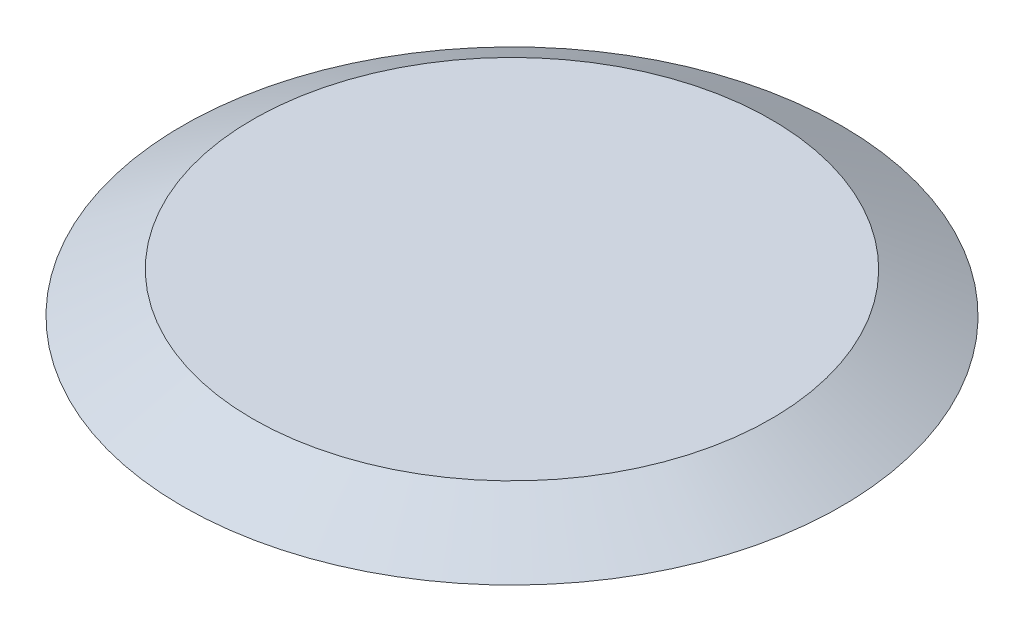
ISO-10303-21;
HEADER;
FILE_DESCRIPTION(('STEP AP214'),'2;1');
FILE_NAME('part.step','',(''),(''),'','','');
FILE_SCHEMA(('AUTOMOTIVE_DESIGN { 1 0 10303 214 1 1 1 1 }'));
ENDSEC;
DATA;
#1=APPLICATION_CONTEXT('core data for automotive mechanical design processes');
#2=APPLICATION_PROTOCOL_DEFINITION('international standard','automotive_design',2000,#1);
#3=PRODUCT_CONTEXT('',#1,'mechanical');
#4=PRODUCT('Part','Part','',(#3));
#5=PRODUCT_RELATED_PRODUCT_CATEGORY('part','',(#4));
#6=PRODUCT_DEFINITION_FORMATION('','',#4);
#7=PRODUCT_DEFINITION_CONTEXT('part definition',#1,'design');
#8=PRODUCT_DEFINITION('design','',#6,#7);
#9=PRODUCT_DEFINITION_SHAPE('','',#8);
#10=(LENGTH_UNIT() NAMED_UNIT(*) SI_UNIT(.MILLI.,.METRE.));
#11=(NAMED_UNIT(*) PLANE_ANGLE_UNIT() SI_UNIT($,.RADIAN.));
#12=(NAMED_UNIT(*) SI_UNIT($,.STERADIAN.) SOLID_ANGLE_UNIT());
#13=UNCERTAINTY_MEASURE_WITH_UNIT(LENGTH_MEASURE(1.E-05),#10,'distance_accuracy_value','');
#14=(GEOMETRIC_REPRESENTATION_CONTEXT(3) GLOBAL_UNCERTAINTY_ASSIGNED_CONTEXT((#13)) GLOBAL_UNIT_ASSIGNED_CONTEXT((#10,
#11,#12)) REPRESENTATION_CONTEXT('',''));
#15=CARTESIAN_POINT('',(0.,0.,0.));
#16=DIRECTION('',(0.,0.,1.));
#17=DIRECTION('',(1.,0.,0.));
#18=AXIS2_PLACEMENT_3D('',#15,#16,#17);
#19=CARTESIAN_POINT('',(0.,0.,0.));
#20=DIRECTION('',(0.,-1.,0.));
#21=DIRECTION('',(0.,0.,1.));
#22=AXIS2_PLACEMENT_3D('',#19,#20,#21);
#23=CONICAL_SURFACE('',#22,8.255,1.0471975511966);
#24=CARTESIAN_POINT('',(0.,1.016,0.));
#25=DIRECTION('',(0.,1.,0.));
#26=DIRECTION('',(0.,0.,1.));
#27=AXIS2_PLACEMENT_3D('',#24,#25,#26);
#28=CIRCLE('',#27,6.49523637951001);
#29=CARTESIAN_POINT('',(0.,1.016,6.49523637951001));
#30=VERTEX_POINT('',#29);
#31=EDGE_CURVE('E10',#30,#30,#28,.T.);
#32=ORIENTED_EDGE('',*,*,#31,.F.);
#33=EDGE_LOOP('',(#32));
#34=FACE_BOUND('',#33,.T.);
#35=CARTESIAN_POINT('',(0.,0.,0.));
#36=DIRECTION('',(0.,1.,0.));
#37=DIRECTION('',(0.,0.,1.));
#38=AXIS2_PLACEMENT_3D('',#35,#36,#37);
#39=CIRCLE('',#38,8.255);
#40=CARTESIAN_POINT('',(0.,0.,8.255));
#41=VERTEX_POINT('',#40);
#42=EDGE_CURVE('E50',#41,#41,#39,.T.);
#43=ORIENTED_EDGE('',*,*,#42,.T.);
#44=EDGE_LOOP('',(#43));
#45=FACE_BOUND('',#44,.T.);
#46=ADVANCED_FACE('F43',(#34,#45),#23,.T.);
#47=CARTESIAN_POINT('',(0.,1.016,0.));
#48=DIRECTION('',(0.,1.,0.));
#49=DIRECTION('',(0.,0.,1.));
#50=AXIS2_PLACEMENT_3D('',#47,#48,#49);
#51=PLANE('',#50);
#52=ORIENTED_EDGE('',*,*,#31,.T.);
#53=EDGE_LOOP('',(#52));
#54=FACE_BOUND('',#53,.T.);
#55=ADVANCED_FACE('F60',(#54),#51,.T.);
#56=CARTESIAN_POINT('',(0.,0.,0.));
#57=DIRECTION('',(0.,1.,0.));
#58=DIRECTION('',(0.,0.,1.));
#59=AXIS2_PLACEMENT_3D('',#56,#57,#58);
#60=PLANE('',#59);
#61=ORIENTED_EDGE('',*,*,#42,.F.);
#62=EDGE_LOOP('',(#61));
#63=FACE_BOUND('',#62,.T.);
#64=ADVANCED_FACE('F58',(#63),#60,.F.);
#65=CLOSED_SHELL('',(#46,#55,#64));
#66=MANIFOLD_SOLID_BREP('B2',#65);
#67=ADVANCED_BREP_SHAPE_REPRESENTATION('',(#18,#66),#14);
#68=SHAPE_DEFINITION_REPRESENTATION(#9,#67);
ENDSEC;
END-ISO-10303-21;
